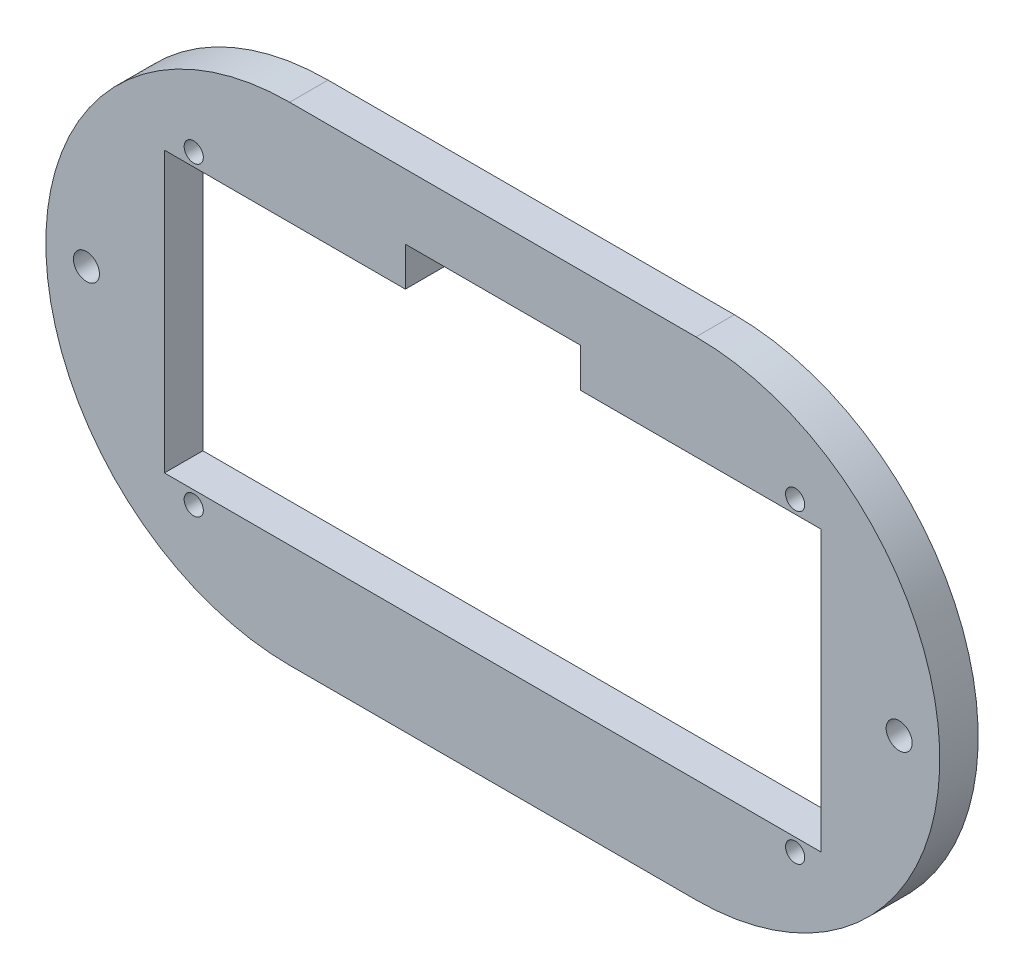
ISO-10303-21;
HEADER;
FILE_DESCRIPTION(('STEP AP214'),'2;1');
FILE_NAME('part.step','',(''),(''),'','','');
FILE_SCHEMA(('AUTOMOTIVE_DESIGN { 1 0 10303 214 1 1 1 1 }'));
ENDSEC;
DATA;
#1=APPLICATION_CONTEXT('core data for automotive mechanical design processes');
#2=APPLICATION_PROTOCOL_DEFINITION('international standard','automotive_design',2000,#1);
#3=PRODUCT_CONTEXT('',#1,'mechanical');
#4=PRODUCT('Part','Part','',(#3));
#5=PRODUCT_RELATED_PRODUCT_CATEGORY('part','',(#4));
#6=PRODUCT_DEFINITION_FORMATION('','',#4);
#7=PRODUCT_DEFINITION_CONTEXT('part definition',#1,'design');
#8=PRODUCT_DEFINITION('design','',#6,#7);
#9=PRODUCT_DEFINITION_SHAPE('','',#8);
#10=(LENGTH_UNIT() NAMED_UNIT(*) SI_UNIT(.MILLI.,.METRE.));
#11=(NAMED_UNIT(*) PLANE_ANGLE_UNIT() SI_UNIT($,.RADIAN.));
#12=(NAMED_UNIT(*) SI_UNIT($,.STERADIAN.) SOLID_ANGLE_UNIT());
#13=UNCERTAINTY_MEASURE_WITH_UNIT(LENGTH_MEASURE(1.E-05),#10,'distance_accuracy_value','');
#14=(GEOMETRIC_REPRESENTATION_CONTEXT(3) GLOBAL_UNCERTAINTY_ASSIGNED_CONTEXT((#13)) GLOBAL_UNIT_ASSIGNED_CONTEXT((#10,
#11,#12)) REPRESENTATION_CONTEXT('',''));
#15=CARTESIAN_POINT('',(0.,0.,0.));
#16=DIRECTION('',(0.,0.,1.));
#17=DIRECTION('',(1.,0.,0.));
#18=AXIS2_PLACEMENT_3D('',#15,#16,#17);
#19=CARTESIAN_POINT('',(9.52500000000001,10.668,3.));
#20=DIRECTION('',(0.,0.,1.));
#21=DIRECTION('',(1.,0.,0.));
#22=AXIS2_PLACEMENT_3D('',#19,#20,#21);
#23=PLANE('',#22);
#24=CARTESIAN_POINT('',(49.022,-1.27,3.));
#25=DIRECTION('',(0.,0.,1.));
#26=DIRECTION('',(1.,0.,0.));
#27=AXIS2_PLACEMENT_3D('',#24,#25,#26);
#28=CIRCLE('',#27,0.749999999999999);
#29=CARTESIAN_POINT('',(49.772,-1.27,3.));
#30=VERTEX_POINT('',#29);
#31=EDGE_CURVE('E232',#30,#30,#28,.T.);
#32=ORIENTED_EDGE('',*,*,#31,.F.);
#33=EDGE_LOOP('',(#32));
#34=FACE_BOUND('',#33,.T.);
#35=CARTESIAN_POINT('',(2.032,22.606,3.));
#36=DIRECTION('',(0.,0.,1.));
#37=DIRECTION('',(1.,0.,0.));
#38=AXIS2_PLACEMENT_3D('',#35,#36,#37);
#39=CIRCLE('',#38,0.750000000000001);
#40=CARTESIAN_POINT('',(2.782,22.606,3.));
#41=VERTEX_POINT('',#40);
#42=EDGE_CURVE('E248',#41,#41,#39,.T.);
#43=ORIENTED_EDGE('',*,*,#42,.F.);
#44=EDGE_LOOP('',(#43));
#45=FACE_BOUND('',#44,.T.);
#46=CARTESIAN_POINT('',(57.15,10.668,3.));
#47=DIRECTION('',(0.,0.,1.));
#48=DIRECTION('',(1.,0.,0.));
#49=AXIS2_PLACEMENT_3D('',#46,#47,#48);
#50=CIRCLE('',#49,1.016);
#51=CARTESIAN_POINT('',(58.166,10.668,3.));
#52=VERTEX_POINT('',#51);
#53=EDGE_CURVE('E264',#52,#52,#50,.T.);
#54=ORIENTED_EDGE('',*,*,#53,.F.);
#55=EDGE_LOOP('',(#54));
#56=FACE_BOUND('',#55,.T.);
#57=CARTESIAN_POINT('',(9.52500000000001,10.668,3.));
#58=DIRECTION('',(0.,0.,1.));
#59=DIRECTION('',(1.,0.,0.));
#60=AXIS2_PLACEMENT_3D('',#57,#58,#59);
#61=CIRCLE('',#60,19.05);
#62=CARTESIAN_POINT('',(9.52500000000001,29.718,3.));
#63=VERTEX_POINT('',#62);
#64=CARTESIAN_POINT('',(9.525,-8.382,3.));
#65=VERTEX_POINT('',#64);
#66=EDGE_CURVE('E272',#63,#65,#61,.T.);
#67=ORIENTED_EDGE('',*,*,#66,.T.);
#68=DIRECTION('',(1.,0.,0.));
#69=VECTOR('',#68,1.);
#70=CARTESIAN_POINT('',(9.525,-8.382,3.));
#71=LINE('',#70,#69);
#72=CARTESIAN_POINT('',(41.275,-8.382,3.));
#73=VERTEX_POINT('',#72);
#74=EDGE_CURVE('E276',#65,#73,#71,.T.);
#75=ORIENTED_EDGE('',*,*,#74,.T.);
#76=CARTESIAN_POINT('',(41.275,10.668,3.));
#77=DIRECTION('',(0.,0.,1.));
#78=DIRECTION('',(1.,0.,0.));
#79=AXIS2_PLACEMENT_3D('',#76,#77,#78);
#80=CIRCLE('',#79,19.05);
#81=CARTESIAN_POINT('',(41.275,29.718,3.));
#82=VERTEX_POINT('',#81);
#83=EDGE_CURVE('E280',#73,#82,#80,.T.);
#84=ORIENTED_EDGE('',*,*,#83,.T.);
#85=DIRECTION('',(-1.,0.,0.));
#86=VECTOR('',#85,1.);
#87=CARTESIAN_POINT('',(9.52500000000001,29.718,3.));
#88=LINE('',#87,#86);
#89=EDGE_CURVE('E283',#82,#63,#88,.T.);
#90=ORIENTED_EDGE('',*,*,#89,.T.);
#91=EDGE_LOOP('',(#67,#75,#84,#90));
#92=FACE_BOUND('',#91,.T.);
#93=CARTESIAN_POINT('',(-6.35,10.668,3.));
#94=DIRECTION('',(0.,0.,1.));
#95=DIRECTION('',(1.,0.,0.));
#96=AXIS2_PLACEMENT_3D('',#93,#94,#95);
#97=CIRCLE('',#96,1.016);
#98=CARTESIAN_POINT('',(-5.334,10.668,3.));
#99=VERTEX_POINT('',#98);
#100=EDGE_CURVE('E256',#99,#99,#97,.T.);
#101=ORIENTED_EDGE('',*,*,#100,.F.);
#102=EDGE_LOOP('',(#101));
#103=FACE_BOUND('',#102,.T.);
#104=CARTESIAN_POINT('',(2.032,-1.27,3.));
#105=DIRECTION('',(0.,0.,1.));
#106=DIRECTION('',(1.,0.,0.));
#107=AXIS2_PLACEMENT_3D('',#104,#105,#106);
#108=CIRCLE('',#107,0.750000000000001);
#109=CARTESIAN_POINT('',(2.782,-1.27,3.));
#110=VERTEX_POINT('',#109);
#111=EDGE_CURVE('E240',#110,#110,#108,.T.);
#112=ORIENTED_EDGE('',*,*,#111,.F.);
#113=EDGE_LOOP('',(#112));
#114=FACE_BOUND('',#113,.T.);
#115=CARTESIAN_POINT('',(49.022,22.606,3.));
#116=DIRECTION('',(0.,0.,1.));
#117=DIRECTION('',(1.,0.,0.));
#118=AXIS2_PLACEMENT_3D('',#115,#116,#117);
#119=CIRCLE('',#118,0.749999999999999);
#120=CARTESIAN_POINT('',(49.772,22.606,3.));
#121=VERTEX_POINT('',#120);
#122=EDGE_CURVE('E224',#121,#121,#119,.T.);
#123=ORIENTED_EDGE('',*,*,#122,.F.);
#124=EDGE_LOOP('',(#123));
#125=FACE_BOUND('',#124,.T.);
#126=DIRECTION('',(-1.,0.,0.));
#127=VECTOR('',#126,1.);
#128=CARTESIAN_POINT('',(18.5674,21.59,3.));
#129=LINE('',#128,#127);
#130=CARTESIAN_POINT('',(18.5674,21.59,3.));
#131=VERTEX_POINT('',#130);
#132=CARTESIAN_POINT('',(-0.254,21.59,3.));
#133=VERTEX_POINT('',#132);
#134=EDGE_CURVE('E144',#131,#133,#129,.T.);
#135=ORIENTED_EDGE('',*,*,#134,.F.);
#136=DIRECTION('',(0.,-1.,0.));
#137=VECTOR('',#136,1.);
#138=CARTESIAN_POINT('',(18.5674,24.638,3.));
#139=LINE('',#138,#137);
#140=CARTESIAN_POINT('',(18.5674,24.638,3.));
#141=VERTEX_POINT('',#140);
#142=EDGE_CURVE('E135',#141,#131,#139,.T.);
#143=ORIENTED_EDGE('',*,*,#142,.F.);
#144=DIRECTION('',(-1.,0.,0.));
#145=VECTOR('',#144,1.);
#146=CARTESIAN_POINT('',(18.5674,24.638,3.));
#147=LINE('',#146,#145);
#148=CARTESIAN_POINT('',(32.2326,24.638,3.));
#149=VERTEX_POINT('',#148);
#150=EDGE_CURVE('E176',#149,#141,#147,.T.);
#151=ORIENTED_EDGE('',*,*,#150,.F.);
#152=DIRECTION('',(0.,1.,0.));
#153=VECTOR('',#152,1.);
#154=CARTESIAN_POINT('',(32.2326,24.638,3.));
#155=LINE('',#154,#153);
#156=CARTESIAN_POINT('',(32.2326,21.59,3.));
#157=VERTEX_POINT('',#156);
#158=EDGE_CURVE('E173',#157,#149,#155,.T.);
#159=ORIENTED_EDGE('',*,*,#158,.F.);
#160=DIRECTION('',(-1.,0.,0.));
#161=VECTOR('',#160,1.);
#162=CARTESIAN_POINT('',(51.054,21.59,3.));
#163=LINE('',#162,#161);
#164=CARTESIAN_POINT('',(51.054,21.59,3.));
#165=VERTEX_POINT('',#164);
#166=EDGE_CURVE('E170',#165,#157,#163,.T.);
#167=ORIENTED_EDGE('',*,*,#166,.F.);
#168=DIRECTION('',(0.,1.,0.));
#169=VECTOR('',#168,1.);
#170=CARTESIAN_POINT('',(51.054,-0.254,3.));
#171=LINE('',#170,#169);
#172=CARTESIAN_POINT('',(51.054,-0.254,3.));
#173=VERTEX_POINT('',#172);
#174=EDGE_CURVE('E167',#173,#165,#171,.T.);
#175=ORIENTED_EDGE('',*,*,#174,.F.);
#176=DIRECTION('',(1.,0.,0.));
#177=VECTOR('',#176,1.);
#178=CARTESIAN_POINT('',(-0.254,-0.254,3.));
#179=LINE('',#178,#177);
#180=CARTESIAN_POINT('',(-0.254,-0.254,3.));
#181=VERTEX_POINT('',#180);
#182=EDGE_CURVE('E162',#181,#173,#179,.T.);
#183=ORIENTED_EDGE('',*,*,#182,.F.);
#184=DIRECTION('',(0.,-1.,0.));
#185=VECTOR('',#184,1.);
#186=CARTESIAN_POINT('',(-0.254,21.59,3.));
#187=LINE('',#186,#185);
#188=EDGE_CURVE('E158',#133,#181,#187,.T.);
#189=ORIENTED_EDGE('',*,*,#188,.F.);
#190=EDGE_LOOP('',(#135,#143,#151,#159,#167,#175,#183,#189));
#191=FACE_BOUND('',#190,.T.);
#192=ADVANCED_FACE('F45',(#34,#45,#56,#92,#103,#114,#125,#191),#23,.T.);
#193=CARTESIAN_POINT('',(9.52500000000001,10.668,0.));
#194=DIRECTION('',(0.,0.,1.));
#195=DIRECTION('',(1.,0.,0.));
#196=AXIS2_PLACEMENT_3D('',#193,#194,#195);
#197=PLANE('',#196);
#198=CARTESIAN_POINT('',(49.022,22.606,0.));
#199=DIRECTION('',(0.,0.,1.));
#200=DIRECTION('',(1.,0.,0.));
#201=AXIS2_PLACEMENT_3D('',#198,#199,#200);
#202=CIRCLE('',#201,0.749999999999999);
#203=CARTESIAN_POINT('',(49.772,22.606,0.));
#204=VERTEX_POINT('',#203);
#205=EDGE_CURVE('E153',#204,#204,#202,.T.);
#206=ORIENTED_EDGE('',*,*,#205,.T.);
#207=EDGE_LOOP('',(#206));
#208=FACE_BOUND('',#207,.T.);
#209=CARTESIAN_POINT('',(49.022,-1.27,0.));
#210=DIRECTION('',(0.,0.,1.));
#211=DIRECTION('',(1.,0.,0.));
#212=AXIS2_PLACEMENT_3D('',#209,#210,#211);
#213=CIRCLE('',#212,0.749999999999999);
#214=CARTESIAN_POINT('',(49.772,-1.27,0.));
#215=VERTEX_POINT('',#214);
#216=EDGE_CURVE('E228',#215,#215,#213,.T.);
#217=ORIENTED_EDGE('',*,*,#216,.T.);
#218=EDGE_LOOP('',(#217));
#219=FACE_BOUND('',#218,.T.);
#220=CARTESIAN_POINT('',(2.032,-1.27,0.));
#221=DIRECTION('',(0.,0.,1.));
#222=DIRECTION('',(1.,0.,0.));
#223=AXIS2_PLACEMENT_3D('',#220,#221,#222);
#224=CIRCLE('',#223,0.750000000000001);
#225=CARTESIAN_POINT('',(2.782,-1.27,0.));
#226=VERTEX_POINT('',#225);
#227=EDGE_CURVE('E236',#226,#226,#224,.T.);
#228=ORIENTED_EDGE('',*,*,#227,.T.);
#229=EDGE_LOOP('',(#228));
#230=FACE_BOUND('',#229,.T.);
#231=CARTESIAN_POINT('',(2.032,22.606,0.));
#232=DIRECTION('',(0.,0.,1.));
#233=DIRECTION('',(1.,0.,0.));
#234=AXIS2_PLACEMENT_3D('',#231,#232,#233);
#235=CIRCLE('',#234,0.750000000000001);
#236=CARTESIAN_POINT('',(2.782,22.606,0.));
#237=VERTEX_POINT('',#236);
#238=EDGE_CURVE('E244',#237,#237,#235,.T.);
#239=ORIENTED_EDGE('',*,*,#238,.T.);
#240=EDGE_LOOP('',(#239));
#241=FACE_BOUND('',#240,.T.);
#242=CARTESIAN_POINT('',(-6.35,10.668,0.));
#243=DIRECTION('',(0.,0.,1.));
#244=DIRECTION('',(1.,0.,0.));
#245=AXIS2_PLACEMENT_3D('',#242,#243,#244);
#246=CIRCLE('',#245,1.016);
#247=CARTESIAN_POINT('',(-5.334,10.668,0.));
#248=VERTEX_POINT('',#247);
#249=EDGE_CURVE('E252',#248,#248,#246,.T.);
#250=ORIENTED_EDGE('',*,*,#249,.T.);
#251=EDGE_LOOP('',(#250));
#252=FACE_BOUND('',#251,.T.);
#253=CARTESIAN_POINT('',(57.15,10.668,0.));
#254=DIRECTION('',(0.,0.,1.));
#255=DIRECTION('',(1.,0.,0.));
#256=AXIS2_PLACEMENT_3D('',#253,#254,#255);
#257=CIRCLE('',#256,1.016);
#258=CARTESIAN_POINT('',(58.166,10.668,0.));
#259=VERTEX_POINT('',#258);
#260=EDGE_CURVE('E260',#259,#259,#257,.T.);
#261=ORIENTED_EDGE('',*,*,#260,.T.);
#262=EDGE_LOOP('',(#261));
#263=FACE_BOUND('',#262,.T.);
#264=CARTESIAN_POINT('',(9.52500000000001,10.668,0.));
#265=DIRECTION('',(0.,0.,1.));
#266=DIRECTION('',(1.,0.,0.));
#267=AXIS2_PLACEMENT_3D('',#264,#265,#266);
#268=CIRCLE('',#267,19.05);
#269=CARTESIAN_POINT('',(9.52500000000001,29.718,0.));
#270=VERTEX_POINT('',#269);
#271=CARTESIAN_POINT('',(9.525,-8.382,0.));
#272=VERTEX_POINT('',#271);
#273=EDGE_CURVE('E268',#270,#272,#268,.T.);
#274=ORIENTED_EDGE('',*,*,#273,.F.);
#275=DIRECTION('',(-1.,0.,0.));
#276=VECTOR('',#275,1.);
#277=CARTESIAN_POINT('',(9.52500000000001,29.718,0.));
#278=LINE('',#277,#276);
#279=CARTESIAN_POINT('',(41.275,29.718,0.));
#280=VERTEX_POINT('',#279);
#281=EDGE_CURVE('E277',#280,#270,#278,.T.);
#282=ORIENTED_EDGE('',*,*,#281,.F.);
#283=CARTESIAN_POINT('',(41.275,10.668,0.));
#284=DIRECTION('',(0.,0.,1.));
#285=DIRECTION('',(1.,0.,0.));
#286=AXIS2_PLACEMENT_3D('',#283,#284,#285);
#287=CIRCLE('',#286,19.05);
#288=CARTESIAN_POINT('',(41.275,-8.382,0.));
#289=VERTEX_POINT('',#288);
#290=EDGE_CURVE('E293',#289,#280,#287,.T.);
#291=ORIENTED_EDGE('',*,*,#290,.F.);
#292=DIRECTION('',(1.,0.,0.));
#293=VECTOR('',#292,1.);
#294=CARTESIAN_POINT('',(9.525,-8.382,0.));
#295=LINE('',#294,#293);
#296=EDGE_CURVE('E290',#272,#289,#295,.T.);
#297=ORIENTED_EDGE('',*,*,#296,.F.);
#298=EDGE_LOOP('',(#274,#282,#291,#297));
#299=FACE_BOUND('',#298,.T.);
#300=DIRECTION('',(0.,-1.,0.));
#301=VECTOR('',#300,1.);
#302=CARTESIAN_POINT('',(18.5674,24.638,0.));
#303=LINE('',#302,#301);
#304=CARTESIAN_POINT('',(18.5674,24.638,0.));
#305=VERTEX_POINT('',#304);
#306=CARTESIAN_POINT('',(18.5674,21.59,0.));
#307=VERTEX_POINT('',#306);
#308=EDGE_CURVE('E69',#305,#307,#303,.T.);
#309=ORIENTED_EDGE('',*,*,#308,.T.);
#310=DIRECTION('',(-1.,0.,0.));
#311=VECTOR('',#310,1.);
#312=CARTESIAN_POINT('',(18.5674,21.59,0.));
#313=LINE('',#312,#311);
#314=CARTESIAN_POINT('',(-0.254,21.59,0.));
#315=VERTEX_POINT('',#314);
#316=EDGE_CURVE('E151',#307,#315,#313,.T.);
#317=ORIENTED_EDGE('',*,*,#316,.T.);
#318=DIRECTION('',(0.,-1.,0.));
#319=VECTOR('',#318,1.);
#320=CARTESIAN_POINT('',(-0.254,21.59,0.));
#321=LINE('',#320,#319);
#322=CARTESIAN_POINT('',(-0.254,-0.254,0.));
#323=VERTEX_POINT('',#322);
#324=EDGE_CURVE('E183',#315,#323,#321,.T.);
#325=ORIENTED_EDGE('',*,*,#324,.T.);
#326=DIRECTION('',(1.,0.,0.));
#327=VECTOR('',#326,1.);
#328=CARTESIAN_POINT('',(-0.254,-0.254,0.));
#329=LINE('',#328,#327);
#330=CARTESIAN_POINT('',(51.054,-0.254,0.));
#331=VERTEX_POINT('',#330);
#332=EDGE_CURVE('E187',#323,#331,#329,.T.);
#333=ORIENTED_EDGE('',*,*,#332,.T.);
#334=DIRECTION('',(0.,1.,0.));
#335=VECTOR('',#334,1.);
#336=CARTESIAN_POINT('',(51.054,-0.254,0.));
#337=LINE('',#336,#335);
#338=CARTESIAN_POINT('',(51.054,21.59,0.));
#339=VERTEX_POINT('',#338);
#340=EDGE_CURVE('E191',#331,#339,#337,.T.);
#341=ORIENTED_EDGE('',*,*,#340,.T.);
#342=DIRECTION('',(-1.,0.,0.));
#343=VECTOR('',#342,1.);
#344=CARTESIAN_POINT('',(51.054,21.59,0.));
#345=LINE('',#344,#343);
#346=CARTESIAN_POINT('',(32.2326,21.59,0.));
#347=VERTEX_POINT('',#346);
#348=EDGE_CURVE('E195',#339,#347,#345,.T.);
#349=ORIENTED_EDGE('',*,*,#348,.T.);
#350=DIRECTION('',(0.,1.,0.));
#351=VECTOR('',#350,1.);
#352=CARTESIAN_POINT('',(32.2326,24.638,0.));
#353=LINE('',#352,#351);
#354=CARTESIAN_POINT('',(32.2326,24.638,0.));
#355=VERTEX_POINT('',#354);
#356=EDGE_CURVE('E199',#347,#355,#353,.T.);
#357=ORIENTED_EDGE('',*,*,#356,.T.);
#358=DIRECTION('',(-1.,0.,0.));
#359=VECTOR('',#358,1.);
#360=CARTESIAN_POINT('',(18.5674,24.638,0.));
#361=LINE('',#360,#359);
#362=EDGE_CURVE('E145',#355,#305,#361,.T.);
#363=ORIENTED_EDGE('',*,*,#362,.T.);
#364=EDGE_LOOP('',(#309,#317,#325,#333,#341,#349,#357,#363));
#365=FACE_BOUND('',#364,.T.);
#366=ADVANCED_FACE('F316',(#208,#219,#230,#241,#252,#263,#299,#365),#197,.F.);
#367=CARTESIAN_POINT('',(9.52500000000001,10.668,3.));
#368=DIRECTION('',(0.,0.,-1.));
#369=DIRECTION('',(-1.,0.,0.));
#370=AXIS2_PLACEMENT_3D('',#367,#368,#369);
#371=CYLINDRICAL_SURFACE('',#370,19.05);
#372=ORIENTED_EDGE('',*,*,#273,.T.);
#373=DIRECTION('',(0.,0.,-1.));
#374=VECTOR('',#373,1.);
#375=CARTESIAN_POINT('',(9.525,-8.382,3.));
#376=LINE('',#375,#374);
#377=EDGE_CURVE('E11',#65,#272,#376,.T.);
#378=ORIENTED_EDGE('',*,*,#377,.F.);
#379=ORIENTED_EDGE('',*,*,#66,.F.);
#380=DIRECTION('',(0.,0.,-1.));
#381=VECTOR('',#380,1.);
#382=CARTESIAN_POINT('',(9.52500000000001,29.718,3.));
#383=LINE('',#382,#381);
#384=EDGE_CURVE('E286',#63,#270,#383,.T.);
#385=ORIENTED_EDGE('',*,*,#384,.T.);
#386=EDGE_LOOP('',(#372,#378,#379,#385));
#387=FACE_BOUND('',#386,.T.);
#388=ADVANCED_FACE('F47',(#387),#371,.T.);
#389=CARTESIAN_POINT('',(9.525,-8.382,3.));
#390=DIRECTION('',(0.,1.,0.));
#391=DIRECTION('',(0.,0.,1.));
#392=AXIS2_PLACEMENT_3D('',#389,#390,#391);
#393=PLANE('',#392);
#394=ORIENTED_EDGE('',*,*,#296,.T.);
#395=DIRECTION('',(0.,0.,-1.));
#396=VECTOR('',#395,1.);
#397=CARTESIAN_POINT('',(41.275,-8.382,3.));
#398=LINE('',#397,#396);
#399=EDGE_CURVE('E54',#73,#289,#398,.T.);
#400=ORIENTED_EDGE('',*,*,#399,.F.);
#401=ORIENTED_EDGE('',*,*,#74,.F.);
#402=ORIENTED_EDGE('',*,*,#377,.T.);
#403=EDGE_LOOP('',(#394,#400,#401,#402));
#404=FACE_BOUND('',#403,.T.);
#405=ADVANCED_FACE('F327',(#404),#393,.F.);
#406=CARTESIAN_POINT('',(41.275,10.668,3.));
#407=DIRECTION('',(0.,0.,-1.));
#408=DIRECTION('',(-1.,0.,0.));
#409=AXIS2_PLACEMENT_3D('',#406,#407,#408);
#410=CYLINDRICAL_SURFACE('',#409,19.05);
#411=ORIENTED_EDGE('',*,*,#290,.T.);
#412=DIRECTION('',(0.,0.,-1.));
#413=VECTOR('',#412,1.);
#414=CARTESIAN_POINT('',(41.275,29.718,3.));
#415=LINE('',#414,#413);
#416=EDGE_CURVE('E301',#82,#280,#415,.T.);
#417=ORIENTED_EDGE('',*,*,#416,.F.);
#418=ORIENTED_EDGE('',*,*,#83,.F.);
#419=ORIENTED_EDGE('',*,*,#399,.T.);
#420=EDGE_LOOP('',(#411,#417,#418,#419));
#421=FACE_BOUND('',#420,.T.);
#422=ADVANCED_FACE('F310',(#421),#410,.T.);
#423=CARTESIAN_POINT('',(9.52500000000001,29.718,3.));
#424=DIRECTION('',(0.,-1.,0.));
#425=DIRECTION('',(0.,0.,-1.));
#426=AXIS2_PLACEMENT_3D('',#423,#424,#425);
#427=PLANE('',#426);
#428=ORIENTED_EDGE('',*,*,#281,.T.);
#429=ORIENTED_EDGE('',*,*,#384,.F.);
#430=ORIENTED_EDGE('',*,*,#89,.F.);
#431=ORIENTED_EDGE('',*,*,#416,.T.);
#432=EDGE_LOOP('',(#428,#429,#430,#431));
#433=FACE_BOUND('',#432,.T.);
#434=ADVANCED_FACE('F320',(#433),#427,.F.);
#435=CARTESIAN_POINT('',(57.15,10.668,3.));
#436=DIRECTION('',(0.,0.,-1.));
#437=DIRECTION('',(-1.,0.,0.));
#438=AXIS2_PLACEMENT_3D('',#435,#436,#437);
#439=CYLINDRICAL_SURFACE('',#438,1.016);
#440=ORIENTED_EDGE('',*,*,#53,.T.);
#441=EDGE_LOOP('',(#440));
#442=FACE_BOUND('',#441,.T.);
#443=ORIENTED_EDGE('',*,*,#260,.F.);
#444=EDGE_LOOP('',(#443));
#445=FACE_BOUND('',#444,.T.);
#446=ADVANCED_FACE('F345',(#442,#445),#439,.F.);
#447=CARTESIAN_POINT('',(-6.35,10.668,3.));
#448=DIRECTION('',(0.,0.,-1.));
#449=DIRECTION('',(-1.,0.,0.));
#450=AXIS2_PLACEMENT_3D('',#447,#448,#449);
#451=CYLINDRICAL_SURFACE('',#450,1.016);
#452=ORIENTED_EDGE('',*,*,#100,.T.);
#453=EDGE_LOOP('',(#452));
#454=FACE_BOUND('',#453,.T.);
#455=ORIENTED_EDGE('',*,*,#249,.F.);
#456=EDGE_LOOP('',(#455));
#457=FACE_BOUND('',#456,.T.);
#458=ADVANCED_FACE('F352',(#454,#457),#451,.F.);
#459=CARTESIAN_POINT('',(2.032,22.606,3.));
#460=DIRECTION('',(0.,0.,-1.));
#461=DIRECTION('',(-1.,0.,0.));
#462=AXIS2_PLACEMENT_3D('',#459,#460,#461);
#463=CYLINDRICAL_SURFACE('',#462,0.750000000000001);
#464=ORIENTED_EDGE('',*,*,#42,.T.);
#465=EDGE_LOOP('',(#464));
#466=FACE_BOUND('',#465,.T.);
#467=ORIENTED_EDGE('',*,*,#238,.F.);
#468=EDGE_LOOP('',(#467));
#469=FACE_BOUND('',#468,.T.);
#470=ADVANCED_FACE('F357',(#466,#469),#463,.F.);
#471=CARTESIAN_POINT('',(2.032,-1.27,3.));
#472=DIRECTION('',(0.,0.,-1.));
#473=DIRECTION('',(-1.,0.,0.));
#474=AXIS2_PLACEMENT_3D('',#471,#472,#473);
#475=CYLINDRICAL_SURFACE('',#474,0.750000000000001);
#476=ORIENTED_EDGE('',*,*,#111,.T.);
#477=EDGE_LOOP('',(#476));
#478=FACE_BOUND('',#477,.T.);
#479=ORIENTED_EDGE('',*,*,#227,.F.);
#480=EDGE_LOOP('',(#479));
#481=FACE_BOUND('',#480,.T.);
#482=ADVANCED_FACE('F367',(#478,#481),#475,.F.);
#483=CARTESIAN_POINT('',(49.022,-1.27,3.));
#484=DIRECTION('',(0.,0.,-1.));
#485=DIRECTION('',(-1.,0.,0.));
#486=AXIS2_PLACEMENT_3D('',#483,#484,#485);
#487=CYLINDRICAL_SURFACE('',#486,0.749999999999999);
#488=ORIENTED_EDGE('',*,*,#31,.T.);
#489=EDGE_LOOP('',(#488));
#490=FACE_BOUND('',#489,.T.);
#491=ORIENTED_EDGE('',*,*,#216,.F.);
#492=EDGE_LOOP('',(#491));
#493=FACE_BOUND('',#492,.T.);
#494=ADVANCED_FACE('F374',(#490,#493),#487,.F.);
#495=CARTESIAN_POINT('',(49.022,22.606,3.));
#496=DIRECTION('',(0.,0.,-1.));
#497=DIRECTION('',(-1.,0.,0.));
#498=AXIS2_PLACEMENT_3D('',#495,#496,#497);
#499=CYLINDRICAL_SURFACE('',#498,0.749999999999999);
#500=ORIENTED_EDGE('',*,*,#122,.T.);
#501=EDGE_LOOP('',(#500));
#502=FACE_BOUND('',#501,.T.);
#503=ORIENTED_EDGE('',*,*,#205,.F.);
#504=EDGE_LOOP('',(#503));
#505=FACE_BOUND('',#504,.T.);
#506=ADVANCED_FACE('F378',(#502,#505),#499,.F.);
#507=CARTESIAN_POINT('',(18.5674,24.638,3.));
#508=DIRECTION('',(1.,0.,0.));
#509=DIRECTION('',(0.,0.,-1.));
#510=AXIS2_PLACEMENT_3D('',#507,#508,#509);
#511=PLANE('',#510);
#512=ORIENTED_EDGE('',*,*,#308,.F.);
#513=DIRECTION('',(0.,0.,-1.));
#514=VECTOR('',#513,1.);
#515=CARTESIAN_POINT('',(18.5674,24.638,3.));
#516=LINE('',#515,#514);
#517=EDGE_CURVE('E139',#141,#305,#516,.T.);
#518=ORIENTED_EDGE('',*,*,#517,.F.);
#519=ORIENTED_EDGE('',*,*,#142,.T.);
#520=DIRECTION('',(0.,0.,-1.));
#521=VECTOR('',#520,1.);
#522=CARTESIAN_POINT('',(18.5674,21.59,3.));
#523=LINE('',#522,#521);
#524=EDGE_CURVE('E138',#131,#307,#523,.T.);
#525=ORIENTED_EDGE('',*,*,#524,.T.);
#526=EDGE_LOOP('',(#512,#518,#519,#525));
#527=FACE_BOUND('',#526,.T.);
#528=ADVANCED_FACE('F137',(#527),#511,.T.);
#529=CARTESIAN_POINT('',(18.5674,21.59,3.));
#530=DIRECTION('',(0.,-1.,0.));
#531=DIRECTION('',(1.,0.,0.));
#532=AXIS2_PLACEMENT_3D('',#529,#530,#531);
#533=PLANE('',#532);
#534=ORIENTED_EDGE('',*,*,#316,.F.);
#535=ORIENTED_EDGE('',*,*,#524,.F.);
#536=ORIENTED_EDGE('',*,*,#134,.T.);
#537=DIRECTION('',(0.,0.,-1.));
#538=VECTOR('',#537,1.);
#539=CARTESIAN_POINT('',(-0.254,21.59,3.));
#540=LINE('',#539,#538);
#541=EDGE_CURVE('E154',#133,#315,#540,.T.);
#542=ORIENTED_EDGE('',*,*,#541,.T.);
#543=EDGE_LOOP('',(#534,#535,#536,#542));
#544=FACE_BOUND('',#543,.T.);
#545=ADVANCED_FACE('F148',(#544),#533,.T.);
#546=CARTESIAN_POINT('',(-0.254,21.59,3.));
#547=DIRECTION('',(1.,0.,0.));
#548=DIRECTION('',(0.,0.,-1.));
#549=AXIS2_PLACEMENT_3D('',#546,#547,#548);
#550=PLANE('',#549);
#551=ORIENTED_EDGE('',*,*,#324,.F.);
#552=ORIENTED_EDGE('',*,*,#541,.F.);
#553=ORIENTED_EDGE('',*,*,#188,.T.);
#554=DIRECTION('',(0.,0.,-1.));
#555=VECTOR('',#554,1.);
#556=CARTESIAN_POINT('',(-0.254,-0.254,3.));
#557=LINE('',#556,#555);
#558=EDGE_CURVE('E219',#181,#323,#557,.T.);
#559=ORIENTED_EDGE('',*,*,#558,.T.);
#560=EDGE_LOOP('',(#551,#552,#553,#559));
#561=FACE_BOUND('',#560,.T.);
#562=ADVANCED_FACE('F387',(#561),#550,.T.);
#563=CARTESIAN_POINT('',(-0.254,-0.254,3.));
#564=DIRECTION('',(0.,1.,0.));
#565=DIRECTION('',(0.,0.,1.));
#566=AXIS2_PLACEMENT_3D('',#563,#564,#565);
#567=PLANE('',#566);
#568=ORIENTED_EDGE('',*,*,#332,.F.);
#569=ORIENTED_EDGE('',*,*,#558,.F.);
#570=ORIENTED_EDGE('',*,*,#182,.T.);
#571=DIRECTION('',(0.,0.,-1.));
#572=VECTOR('',#571,1.);
#573=CARTESIAN_POINT('',(51.054,-0.254,3.));
#574=LINE('',#573,#572);
#575=EDGE_CURVE('E216',#173,#331,#574,.T.);
#576=ORIENTED_EDGE('',*,*,#575,.T.);
#577=EDGE_LOOP('',(#568,#569,#570,#576));
#578=FACE_BOUND('',#577,.T.);
#579=ADVANCED_FACE('F390',(#578),#567,.T.);
#580=CARTESIAN_POINT('',(51.054,-0.254,3.));
#581=DIRECTION('',(-1.,0.,0.));
#582=DIRECTION('',(0.,0.,1.));
#583=AXIS2_PLACEMENT_3D('',#580,#581,#582);
#584=PLANE('',#583);
#585=ORIENTED_EDGE('',*,*,#340,.F.);
#586=ORIENTED_EDGE('',*,*,#575,.F.);
#587=ORIENTED_EDGE('',*,*,#174,.T.);
#588=DIRECTION('',(0.,0.,-1.));
#589=VECTOR('',#588,1.);
#590=CARTESIAN_POINT('',(51.054,21.59,3.));
#591=LINE('',#590,#589);
#592=EDGE_CURVE('E213',#165,#339,#591,.T.);
#593=ORIENTED_EDGE('',*,*,#592,.T.);
#594=EDGE_LOOP('',(#585,#586,#587,#593));
#595=FACE_BOUND('',#594,.T.);
#596=ADVANCED_FACE('F394',(#595),#584,.T.);
#597=CARTESIAN_POINT('',(51.054,21.59,3.));
#598=DIRECTION('',(0.,-1.,0.));
#599=DIRECTION('',(1.,0.,0.));
#600=AXIS2_PLACEMENT_3D('',#597,#598,#599);
#601=PLANE('',#600);
#602=ORIENTED_EDGE('',*,*,#348,.F.);
#603=ORIENTED_EDGE('',*,*,#592,.F.);
#604=ORIENTED_EDGE('',*,*,#166,.T.);
#605=DIRECTION('',(0.,0.,-1.));
#606=VECTOR('',#605,1.);
#607=CARTESIAN_POINT('',(32.2326,21.59,3.));
#608=LINE('',#607,#606);
#609=EDGE_CURVE('E210',#157,#347,#608,.T.);
#610=ORIENTED_EDGE('',*,*,#609,.T.);
#611=EDGE_LOOP('',(#602,#603,#604,#610));
#612=FACE_BOUND('',#611,.T.);
#613=ADVANCED_FACE('F398',(#612),#601,.T.);
#614=CARTESIAN_POINT('',(32.2326,24.638,3.));
#615=DIRECTION('',(-1.,0.,0.));
#616=DIRECTION('',(0.,0.,1.));
#617=AXIS2_PLACEMENT_3D('',#614,#615,#616);
#618=PLANE('',#617);
#619=ORIENTED_EDGE('',*,*,#356,.F.);
#620=ORIENTED_EDGE('',*,*,#609,.F.);
#621=ORIENTED_EDGE('',*,*,#158,.T.);
#622=DIRECTION('',(0.,0.,-1.));
#623=VECTOR('',#622,1.);
#624=CARTESIAN_POINT('',(32.2326,24.638,3.));
#625=LINE('',#624,#623);
#626=EDGE_CURVE('E61',#149,#355,#625,.T.);
#627=ORIENTED_EDGE('',*,*,#626,.T.);
#628=EDGE_LOOP('',(#619,#620,#621,#627));
#629=FACE_BOUND('',#628,.T.);
#630=ADVANCED_FACE('F402',(#629),#618,.T.);
#631=CARTESIAN_POINT('',(18.5674,24.638,3.));
#632=DIRECTION('',(0.,-1.,0.));
#633=DIRECTION('',(0.,0.,-1.));
#634=AXIS2_PLACEMENT_3D('',#631,#632,#633);
#635=PLANE('',#634);
#636=ORIENTED_EDGE('',*,*,#362,.F.);
#637=ORIENTED_EDGE('',*,*,#626,.F.);
#638=ORIENTED_EDGE('',*,*,#150,.T.);
#639=ORIENTED_EDGE('',*,*,#517,.T.);
#640=EDGE_LOOP('',(#636,#637,#638,#639));
#641=FACE_BOUND('',#640,.T.);
#642=ADVANCED_FACE('F406',(#641),#635,.T.);
#643=CLOSED_SHELL('',(#192,#366,#388,#405,#422,#434,#446,#458,#470,#482,#494,#506,#528,#545,
#562,#579,#596,#613,#630,#642));
#644=MANIFOLD_SOLID_BREP('B2',#643);
#645=ADVANCED_BREP_SHAPE_REPRESENTATION('',(#18,#644),#14);
#646=SHAPE_DEFINITION_REPRESENTATION(#9,#645);
ENDSEC;
END-ISO-10303-21;
